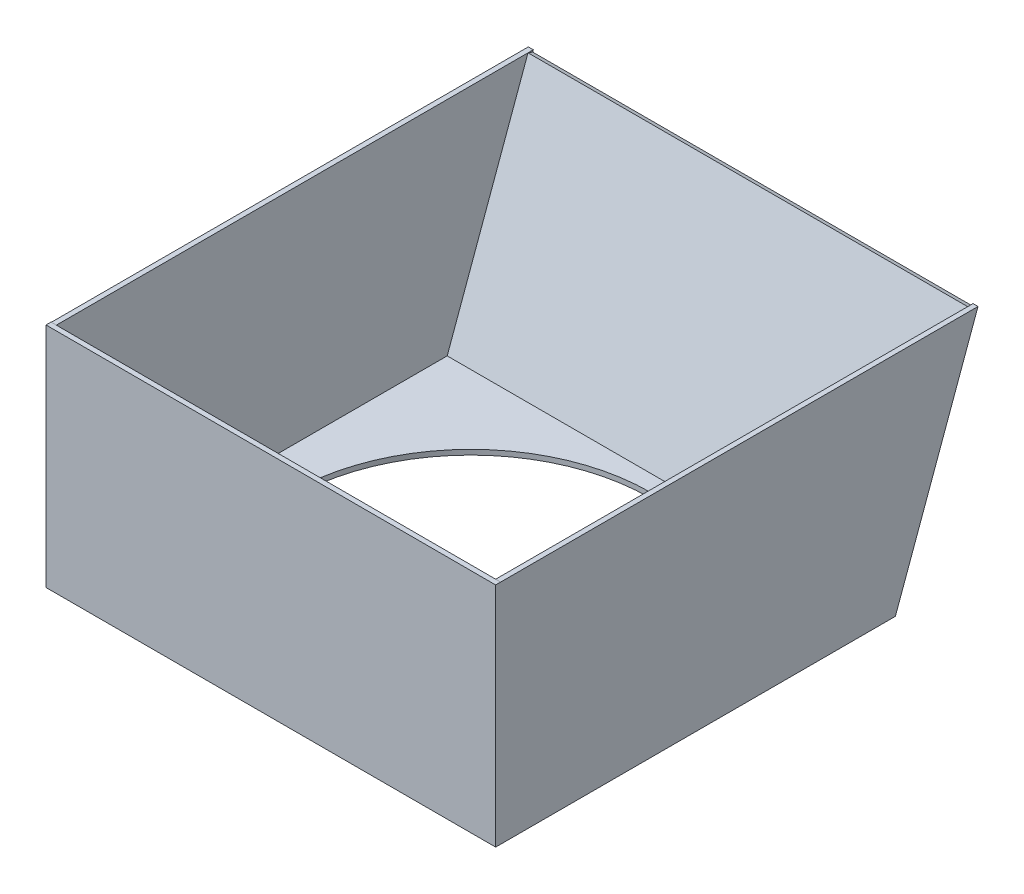
ISO-10303-21;
HEADER;
FILE_DESCRIPTION(('STEP AP214'),'2;1');
FILE_NAME('part.step','',(''),(''),'','','');
FILE_SCHEMA(('AUTOMOTIVE_DESIGN { 1 0 10303 214 1 1 1 1 }'));
ENDSEC;
DATA;
#1=APPLICATION_CONTEXT('core data for automotive mechanical design processes');
#2=APPLICATION_PROTOCOL_DEFINITION('international standard','automotive_design',2000,#1);
#3=PRODUCT_CONTEXT('',#1,'mechanical');
#4=PRODUCT('Part','Part','',(#3));
#5=PRODUCT_RELATED_PRODUCT_CATEGORY('part','',(#4));
#6=PRODUCT_DEFINITION_FORMATION('','',#4);
#7=PRODUCT_DEFINITION_CONTEXT('part definition',#1,'design');
#8=PRODUCT_DEFINITION('design','',#6,#7);
#9=PRODUCT_DEFINITION_SHAPE('','',#8);
#10=(LENGTH_UNIT() NAMED_UNIT(*) SI_UNIT(.MILLI.,.METRE.));
#11=(NAMED_UNIT(*) PLANE_ANGLE_UNIT() SI_UNIT($,.RADIAN.));
#12=(NAMED_UNIT(*) SI_UNIT($,.STERADIAN.) SOLID_ANGLE_UNIT());
#13=UNCERTAINTY_MEASURE_WITH_UNIT(LENGTH_MEASURE(1.E-05),#10,'distance_accuracy_value','');
#14=(GEOMETRIC_REPRESENTATION_CONTEXT(3) GLOBAL_UNCERTAINTY_ASSIGNED_CONTEXT((#13)) GLOBAL_UNIT_ASSIGNED_CONTEXT((#10,
#11,#12)) REPRESENTATION_CONTEXT('',''));
#15=CARTESIAN_POINT('',(0.,0.,0.));
#16=DIRECTION('',(0.,0.,1.));
#17=DIRECTION('',(1.,0.,0.));
#18=AXIS2_PLACEMENT_3D('',#15,#16,#17);
#19=CARTESIAN_POINT('',(0.,2.5,0.));
#20=DIRECTION('',(0.,1.,0.));
#21=DIRECTION('',(0.,0.,1.));
#22=AXIS2_PLACEMENT_3D('',#19,#20,#21);
#23=PLANE('',#22);
#24=DIRECTION('',(-1.,0.,0.));
#25=VECTOR('',#24,1.);
#26=CARTESIAN_POINT('',(0.,2.5,97.5));
#27=LINE('',#26,#25);
#28=CARTESIAN_POINT('',(110.,2.5,97.5));
#29=VERTEX_POINT('',#28);
#30=CARTESIAN_POINT('',(-110.,2.5,97.5));
#31=VERTEX_POINT('',#30);
#32=EDGE_CURVE('E165',#29,#31,#27,.T.);
#33=ORIENTED_EDGE('',*,*,#32,.F.);
#34=DIRECTION('',(0.,0.,1.));
#35=VECTOR('',#34,1.);
#36=CARTESIAN_POINT('',(110.,2.5,0.));
#37=LINE('',#36,#35);
#38=CARTESIAN_POINT('',(110.,2.5,-98.2494811544758));
#39=VERTEX_POINT('',#38);
#40=EDGE_CURVE('E67',#39,#29,#37,.T.);
#41=ORIENTED_EDGE('',*,*,#40,.F.);
#42=DIRECTION('',(-1.,0.,0.));
#43=VECTOR('',#42,1.);
#44=CARTESIAN_POINT('',(0.,2.5,-98.2494811544758));
#45=LINE('',#44,#43);
#46=CARTESIAN_POINT('',(-110.,2.5,-98.2494811544758));
#47=VERTEX_POINT('',#46);
#48=EDGE_CURVE('E222',#39,#47,#45,.T.);
#49=ORIENTED_EDGE('',*,*,#48,.T.);
#50=DIRECTION('',(0.,0.,1.));
#51=VECTOR('',#50,1.);
#52=CARTESIAN_POINT('',(-110.,2.5,0.));
#53=LINE('',#52,#51);
#54=EDGE_CURVE('E215',#47,#31,#53,.T.);
#55=ORIENTED_EDGE('',*,*,#54,.T.);
#56=EDGE_LOOP('',(#33,#41,#49,#55));
#57=FACE_BOUND('',#56,.T.);
#58=CARTESIAN_POINT('',(0.,2.5,0.));
#59=DIRECTION('',(0.,1.,0.));
#60=DIRECTION('',(0.,0.,1.));
#61=AXIS2_PLACEMENT_3D('',#58,#59,#60);
#62=CIRCLE('',#61,90.);
#63=CARTESIAN_POINT('',(0.,2.5,90.));
#64=VERTEX_POINT('',#63);
#65=EDGE_CURVE('E235',#64,#64,#62,.T.);
#66=ORIENTED_EDGE('',*,*,#65,.F.);
#67=EDGE_LOOP('',(#66));
#68=FACE_BOUND('',#67,.T.);
#69=ADVANCED_FACE('F43',(#57,#68),#23,.T.);
#70=CARTESIAN_POINT('',(-112.5,113.618164852623,-138.693185647115));
#71=DIRECTION('',(0.,-0.939692620785909,0.342020143325666));
#72=DIRECTION('',(0.,-0.342020143325666,-0.93969262078591));
#73=AXIS2_PLACEMENT_3D('',#70,#71,#72);
#74=PLANE('',#73);
#75=DIRECTION('',(-1.,0.,0.));
#76=VECTOR('',#75,1.);
#77=CARTESIAN_POINT('',(-112.5,113.618164852623,-138.693185647115));
#78=LINE('',#77,#76);
#79=CARTESIAN_POINT('',(110.,113.618164852623,-138.693185647115));
#80=VERTEX_POINT('',#79);
#81=CARTESIAN_POINT('',(-110.,113.618164852623,-138.693185647115));
#82=VERTEX_POINT('',#81);
#83=EDGE_CURVE('E219',#80,#82,#78,.T.);
#84=ORIENTED_EDGE('',*,*,#83,.F.);
#85=DIRECTION('',(0.,-0.342020143325666,-0.93969262078591));
#86=VECTOR('',#85,1.);
#87=CARTESIAN_POINT('',(110.,113.618164852623,-138.693185647115));
#88=LINE('',#87,#86);
#89=CARTESIAN_POINT('',(110.,112.763114494309,-141.04241719908));
#90=VERTEX_POINT('',#89);
#91=EDGE_CURVE('E187',#80,#90,#88,.T.);
#92=ORIENTED_EDGE('',*,*,#91,.T.);
#93=DIRECTION('',(-1.,0.,0.));
#94=VECTOR('',#93,1.);
#95=CARTESIAN_POINT('',(-112.5,112.763114494309,-141.04241719908));
#96=LINE('',#95,#94);
#97=CARTESIAN_POINT('',(-110.,112.763114494309,-141.04241719908));
#98=VERTEX_POINT('',#97);
#99=EDGE_CURVE('E226',#90,#98,#96,.T.);
#100=ORIENTED_EDGE('',*,*,#99,.T.);
#101=DIRECTION('',(0.,-0.342020143325666,-0.93969262078591));
#102=VECTOR('',#101,1.);
#103=CARTESIAN_POINT('',(-110.,113.618164852623,-138.693185647115));
#104=LINE('',#103,#102);
#105=EDGE_CURVE('E211',#82,#98,#104,.T.);
#106=ORIENTED_EDGE('',*,*,#105,.F.);
#107=EDGE_LOOP('',(#84,#92,#100,#106));
#108=FACE_BOUND('',#107,.T.);
#109=ADVANCED_FACE('F292',(#108),#74,.F.);
#110=CARTESIAN_POINT('',(0.,-31.2843301260126,-85.9529906039844));
#111=DIRECTION('',(0.,-0.342020143325666,-0.93969262078591));
#112=DIRECTION('',(0.,0.93969262078591,-0.342020143325666));
#113=AXIS2_PLACEMENT_3D('',#110,#111,#112);
#114=PLANE('',#113);
#115=ORIENTED_EDGE('',*,*,#48,.F.);
#116=DIRECTION('',(0.,0.93969262078591,-0.342020143325666));
#117=VECTOR('',#116,1.);
#118=CARTESIAN_POINT('',(110.,-31.2843301260126,-85.9529906039844));
#119=LINE('',#118,#117);
#120=EDGE_CURVE('E59',#39,#80,#119,.T.);
#121=ORIENTED_EDGE('',*,*,#120,.T.);
#122=ORIENTED_EDGE('',*,*,#83,.T.);
#123=DIRECTION('',(0.,0.93969262078591,-0.342020143325666));
#124=VECTOR('',#123,1.);
#125=CARTESIAN_POINT('',(-110.,-31.2843301260126,-85.9529906039844));
#126=LINE('',#125,#124);
#127=EDGE_CURVE('E207',#47,#82,#126,.T.);
#128=ORIENTED_EDGE('',*,*,#127,.F.);
#129=EDGE_LOOP('',(#115,#121,#122,#128));
#130=FACE_BOUND('',#129,.T.);
#131=ADVANCED_FACE('F298',(#130),#114,.F.);
#132=CARTESIAN_POINT('',(0.,0.,0.));
#133=DIRECTION('',(0.,1.,0.));
#134=DIRECTION('',(0.,0.,1.));
#135=AXIS2_PLACEMENT_3D('',#132,#133,#134);
#136=PLANE('',#135);
#137=DIRECTION('',(-1.,0.,0.));
#138=VECTOR('',#137,1.);
#139=CARTESIAN_POINT('',(-112.5,0.,-100.));
#140=LINE('',#139,#138);
#141=CARTESIAN_POINT('',(112.5,0.,-100.));
#142=VERTEX_POINT('',#141);
#143=CARTESIAN_POINT('',(-112.5,0.,-100.));
#144=VERTEX_POINT('',#143);
#145=EDGE_CURVE('E245',#142,#144,#140,.T.);
#146=ORIENTED_EDGE('',*,*,#145,.F.);
#147=DIRECTION('',(0.,0.,-1.));
#148=VECTOR('',#147,1.);
#149=CARTESIAN_POINT('',(112.5,0.,-100.));
#150=LINE('',#149,#148);
#151=CARTESIAN_POINT('',(112.5,0.,100.));
#152=VERTEX_POINT('',#151);
#153=EDGE_CURVE('E239',#152,#142,#150,.T.);
#154=ORIENTED_EDGE('',*,*,#153,.F.);
#155=DIRECTION('',(1.,0.,0.));
#156=VECTOR('',#155,1.);
#157=CARTESIAN_POINT('',(-112.5,0.,100.));
#158=LINE('',#157,#156);
#159=CARTESIAN_POINT('',(-112.5,0.,100.));
#160=VERTEX_POINT('',#159);
#161=EDGE_CURVE('E251',#160,#152,#158,.T.);
#162=ORIENTED_EDGE('',*,*,#161,.F.);
#163=DIRECTION('',(0.,0.,1.));
#164=VECTOR('',#163,1.);
#165=CARTESIAN_POINT('',(-112.5,0.,-100.));
#166=LINE('',#165,#164);
#167=EDGE_CURVE('E248',#144,#160,#166,.T.);
#168=ORIENTED_EDGE('',*,*,#167,.F.);
#169=EDGE_LOOP('',(#146,#154,#162,#168));
#170=FACE_BOUND('',#169,.T.);
#171=CARTESIAN_POINT('',(0.,0.,0.));
#172=DIRECTION('',(0.,1.,0.));
#173=DIRECTION('',(0.,0.,1.));
#174=AXIS2_PLACEMENT_3D('',#171,#172,#173);
#175=CIRCLE('',#174,90.);
#176=CARTESIAN_POINT('',(0.,0.,90.));
#177=VERTEX_POINT('',#176);
#178=EDGE_CURVE('E234',#177,#177,#175,.T.);
#179=ORIENTED_EDGE('',*,*,#178,.T.);
#180=EDGE_LOOP('',(#179));
#181=FACE_BOUND('',#180,.T.);
#182=ADVANCED_FACE('F266',(#170,#181),#136,.F.);
#183=CARTESIAN_POINT('',(112.5,2.5,-100.));
#184=DIRECTION('',(-1.,0.,0.));
#185=DIRECTION('',(0.,0.,1.));
#186=AXIS2_PLACEMENT_3D('',#183,#184,#185);
#187=PLANE('',#186);
#188=DIRECTION('',(0.,0.,1.));
#189=VECTOR('',#188,1.);
#190=CARTESIAN_POINT('',(112.5,113.618164852623,-141.353630078305));
#191=LINE('',#190,#189);
#192=CARTESIAN_POINT('',(112.5,113.618164852623,-141.353630078305));
#193=VERTEX_POINT('',#192);
#194=CARTESIAN_POINT('',(112.5,113.618164852623,97.5));
#195=VERTEX_POINT('',#194);
#196=EDGE_CURVE('E160',#193,#195,#191,.T.);
#197=ORIENTED_EDGE('',*,*,#196,.T.);
#198=DIRECTION('',(0.,0.,1.));
#199=VECTOR('',#198,1.);
#200=CARTESIAN_POINT('',(112.5,113.618164852623,97.5));
#201=LINE('',#200,#199);
#202=CARTESIAN_POINT('',(112.5,113.618164852623,100.));
#203=VERTEX_POINT('',#202);
#204=EDGE_CURVE('E131',#195,#203,#201,.T.);
#205=ORIENTED_EDGE('',*,*,#204,.T.);
#206=DIRECTION('',(0.,-1.,0.));
#207=VECTOR('',#206,1.);
#208=CARTESIAN_POINT('',(112.5,2.5,100.));
#209=LINE('',#208,#207);
#210=EDGE_CURVE('E254',#203,#152,#209,.T.);
#211=ORIENTED_EDGE('',*,*,#210,.T.);
#212=ORIENTED_EDGE('',*,*,#153,.T.);
#213=DIRECTION('',(0.,0.93969262078591,-0.342020143325666));
#214=VECTOR('',#213,1.);
#215=CARTESIAN_POINT('',(112.5,112.763114494309,-141.04241719908));
#216=LINE('',#215,#214);
#217=EDGE_CURVE('E168',#142,#193,#216,.T.);
#218=ORIENTED_EDGE('',*,*,#217,.T.);
#219=EDGE_LOOP('',(#197,#205,#211,#212,#218));
#220=FACE_BOUND('',#219,.T.);
#221=ADVANCED_FACE('F45',(#220),#187,.F.);
#222=CARTESIAN_POINT('',(-112.5,2.5,-100.));
#223=DIRECTION('',(1.,0.,0.));
#224=DIRECTION('',(0.,0.,-1.));
#225=AXIS2_PLACEMENT_3D('',#222,#223,#224);
#226=PLANE('',#225);
#227=ORIENTED_EDGE('',*,*,#167,.T.);
#228=DIRECTION('',(0.,-1.,0.));
#229=VECTOR('',#228,1.);
#230=CARTESIAN_POINT('',(-112.5,2.5,100.));
#231=LINE('',#230,#229);
#232=CARTESIAN_POINT('',(-112.5,113.791515022828,100.));
#233=VERTEX_POINT('',#232);
#234=EDGE_CURVE('E52',#233,#160,#231,.T.);
#235=ORIENTED_EDGE('',*,*,#234,.F.);
#236=DIRECTION('',(0.,0.,1.));
#237=VECTOR('',#236,1.);
#238=CARTESIAN_POINT('',(-112.5,113.791515022828,97.5));
#239=LINE('',#238,#237);
#240=CARTESIAN_POINT('',(-112.5,113.791515022828,97.5));
#241=VERTEX_POINT('',#240);
#242=EDGE_CURVE('E144',#241,#233,#239,.T.);
#243=ORIENTED_EDGE('',*,*,#242,.F.);
#244=DIRECTION('',(0.,-1.,0.));
#245=VECTOR('',#244,1.);
#246=CARTESIAN_POINT('',(-112.5,0.,97.5));
#247=LINE('',#246,#245);
#248=CARTESIAN_POINT('',(-112.5,113.618164852623,97.5));
#249=VERTEX_POINT('',#248);
#250=EDGE_CURVE('E145',#241,#249,#247,.T.);
#251=ORIENTED_EDGE('',*,*,#250,.T.);
#252=DIRECTION('',(0.,0.,-1.));
#253=VECTOR('',#252,1.);
#254=CARTESIAN_POINT('',(-112.5,113.618164852623,-141.353630078305));
#255=LINE('',#254,#253);
#256=CARTESIAN_POINT('',(-112.5,113.618164852623,-141.353630078305));
#257=VERTEX_POINT('',#256);
#258=EDGE_CURVE('E192',#249,#257,#255,.T.);
#259=ORIENTED_EDGE('',*,*,#258,.T.);
#260=DIRECTION('',(0.,-0.93969262078591,0.342020143325666));
#261=VECTOR('',#260,1.);
#262=CARTESIAN_POINT('',(-112.5,0.,-100.));
#263=LINE('',#262,#261);
#264=EDGE_CURVE('E223',#257,#144,#263,.T.);
#265=ORIENTED_EDGE('',*,*,#264,.T.);
#266=EDGE_LOOP('',(#227,#235,#243,#251,#259,#265));
#267=FACE_BOUND('',#266,.T.);
#268=ADVANCED_FACE('F312',(#267),#226,.F.);
#269=CARTESIAN_POINT('',(-112.5,2.5,100.));
#270=DIRECTION('',(0.,0.,-1.));
#271=DIRECTION('',(-1.,0.,0.));
#272=AXIS2_PLACEMENT_3D('',#269,#270,#271);
#273=PLANE('',#272);
#274=DIRECTION('',(-0.999999703207228,0.000770444972247089,0.));
#275=VECTOR('',#274,1.);
#276=CARTESIAN_POINT('',(-112.5,113.791515022828,100.));
#277=LINE('',#276,#275);
#278=EDGE_CURVE('E138',#203,#233,#277,.T.);
#279=ORIENTED_EDGE('',*,*,#278,.T.);
#280=ORIENTED_EDGE('',*,*,#234,.T.);
#281=ORIENTED_EDGE('',*,*,#161,.T.);
#282=ORIENTED_EDGE('',*,*,#210,.F.);
#283=EDGE_LOOP('',(#279,#280,#281,#282));
#284=FACE_BOUND('',#283,.T.);
#285=ADVANCED_FACE('F260',(#284),#273,.F.);
#286=CARTESIAN_POINT('',(0.,2.5,0.));
#287=DIRECTION('',(0.,-1.,0.));
#288=DIRECTION('',(0.,0.,-1.));
#289=AXIS2_PLACEMENT_3D('',#286,#287,#288);
#290=CYLINDRICAL_SURFACE('',#289,90.);
#291=ORIENTED_EDGE('',*,*,#65,.T.);
#292=EDGE_LOOP('',(#291));
#293=FACE_BOUND('',#292,.T.);
#294=ORIENTED_EDGE('',*,*,#178,.F.);
#295=EDGE_LOOP('',(#294));
#296=FACE_BOUND('',#295,.T.);
#297=ADVANCED_FACE('F318',(#293,#296),#290,.F.);
#298=CARTESIAN_POINT('',(0.,-32.1393804843268,-88.3022221559492));
#299=DIRECTION('',(0.,-0.342020143325666,-0.93969262078591));
#300=DIRECTION('',(0.,0.93969262078591,-0.342020143325666));
#301=AXIS2_PLACEMENT_3D('',#298,#299,#300);
#302=PLANE('',#301);
#303=ORIENTED_EDGE('',*,*,#99,.F.);
#304=DIRECTION('',(0.,0.939692620785909,-0.342020143325666));
#305=VECTOR('',#304,1.);
#306=CARTESIAN_POINT('',(110.,0.,-100.));
#307=LINE('',#306,#305);
#308=CARTESIAN_POINT('',(110.,113.618164852623,-141.353630078305));
#309=VERTEX_POINT('',#308);
#310=EDGE_CURVE('E171',#90,#309,#307,.T.);
#311=ORIENTED_EDGE('',*,*,#310,.T.);
#312=DIRECTION('',(1.,0.,0.));
#313=VECTOR('',#312,1.);
#314=CARTESIAN_POINT('',(110.,113.618164852623,-141.353630078305));
#315=LINE('',#314,#313);
#316=EDGE_CURVE('E182',#309,#193,#315,.T.);
#317=ORIENTED_EDGE('',*,*,#316,.T.);
#318=ORIENTED_EDGE('',*,*,#217,.F.);
#319=ORIENTED_EDGE('',*,*,#145,.T.);
#320=ORIENTED_EDGE('',*,*,#264,.F.);
#321=DIRECTION('',(-1.,0.,0.));
#322=VECTOR('',#321,1.);
#323=CARTESIAN_POINT('',(-110.,113.618164852623,-141.353630078305));
#324=LINE('',#323,#322);
#325=CARTESIAN_POINT('',(-110.,113.618164852623,-141.353630078305));
#326=VERTEX_POINT('',#325);
#327=EDGE_CURVE('E201',#326,#257,#324,.T.);
#328=ORIENTED_EDGE('',*,*,#327,.F.);
#329=DIRECTION('',(0.,-0.93969262078591,0.342020143325666));
#330=VECTOR('',#329,1.);
#331=CARTESIAN_POINT('',(-110.,0.,-100.));
#332=LINE('',#331,#330);
#333=EDGE_CURVE('E196',#326,#98,#332,.T.);
#334=ORIENTED_EDGE('',*,*,#333,.T.);
#335=EDGE_LOOP('',(#303,#311,#317,#318,#319,#320,#328,#334));
#336=FACE_BOUND('',#335,.T.);
#337=ADVANCED_FACE('F271',(#336),#302,.T.);
#338=CARTESIAN_POINT('',(-110.,113.618164852623,-141.353630078305));
#339=DIRECTION('',(0.,1.,0.));
#340=DIRECTION('',(0.,0.,1.));
#341=AXIS2_PLACEMENT_3D('',#338,#339,#340);
#342=PLANE('',#341);
#343=DIRECTION('',(-1.,0.,0.));
#344=VECTOR('',#343,1.);
#345=CARTESIAN_POINT('',(-110.,113.618164852623,97.5));
#346=LINE('',#345,#344);
#347=CARTESIAN_POINT('',(-110.,113.618164852623,97.5));
#348=VERTEX_POINT('',#347);
#349=EDGE_CURVE('E172',#348,#249,#346,.T.);
#350=ORIENTED_EDGE('',*,*,#349,.F.);
#351=DIRECTION('',(0.,0.,-1.));
#352=VECTOR('',#351,1.);
#353=CARTESIAN_POINT('',(-110.,113.618164852623,-141.353630078305));
#354=LINE('',#353,#352);
#355=EDGE_CURVE('E193',#348,#82,#354,.T.);
#356=ORIENTED_EDGE('',*,*,#355,.T.);
#357=EDGE_CURVE('E197',#82,#326,#354,.T.);
#358=ORIENTED_EDGE('',*,*,#357,.T.);
#359=ORIENTED_EDGE('',*,*,#327,.T.);
#360=ORIENTED_EDGE('',*,*,#258,.F.);
#361=EDGE_LOOP('',(#350,#356,#358,#359,#360));
#362=FACE_BOUND('',#361,.T.);
#363=ADVANCED_FACE('F284',(#362),#342,.T.);
#364=CARTESIAN_POINT('',(-110.,0.,0.));
#365=DIRECTION('',(-1.,0.,0.));
#366=DIRECTION('',(0.,0.,1.));
#367=AXIS2_PLACEMENT_3D('',#364,#365,#366);
#368=PLANE('',#367);
#369=ORIENTED_EDGE('',*,*,#357,.F.);
#370=ORIENTED_EDGE('',*,*,#105,.T.);
#371=ORIENTED_EDGE('',*,*,#333,.F.);
#372=EDGE_LOOP('',(#369,#370,#371));
#373=FACE_BOUND('',#372,.T.);
#374=ADVANCED_FACE('F289',(#373),#368,.F.);
#375=ORIENTED_EDGE('',*,*,#355,.F.);
#376=DIRECTION('',(0.,-1.,0.));
#377=VECTOR('',#376,1.);
#378=CARTESIAN_POINT('',(-110.,0.,97.5));
#379=LINE('',#378,#377);
#380=EDGE_CURVE('E177',#348,#31,#379,.T.);
#381=ORIENTED_EDGE('',*,*,#380,.T.);
#382=ORIENTED_EDGE('',*,*,#54,.F.);
#383=ORIENTED_EDGE('',*,*,#127,.T.);
#384=EDGE_LOOP('',(#375,#381,#382,#383));
#385=FACE_BOUND('',#384,.T.);
#386=ADVANCED_FACE('F296',(#385),#368,.F.);
#387=CARTESIAN_POINT('',(110.,113.618164852623,-141.353630078305));
#388=DIRECTION('',(0.,1.,0.));
#389=DIRECTION('',(0.,0.,1.));
#390=AXIS2_PLACEMENT_3D('',#387,#388,#389);
#391=PLANE('',#390);
#392=DIRECTION('',(-1.,0.,0.));
#393=VECTOR('',#392,1.);
#394=CARTESIAN_POINT('',(110.,113.618164852623,97.5));
#395=LINE('',#394,#393);
#396=CARTESIAN_POINT('',(110.,113.618164852623,97.5));
#397=VERTEX_POINT('',#396);
#398=EDGE_CURVE('E150',#195,#397,#395,.T.);
#399=ORIENTED_EDGE('',*,*,#398,.F.);
#400=ORIENTED_EDGE('',*,*,#196,.F.);
#401=ORIENTED_EDGE('',*,*,#316,.F.);
#402=DIRECTION('',(0.,0.,1.));
#403=VECTOR('',#402,1.);
#404=CARTESIAN_POINT('',(110.,113.618164852623,-141.353630078305));
#405=LINE('',#404,#403);
#406=EDGE_CURVE('E181',#309,#80,#405,.T.);
#407=ORIENTED_EDGE('',*,*,#406,.T.);
#408=EDGE_CURVE('E163',#80,#397,#405,.T.);
#409=ORIENTED_EDGE('',*,*,#408,.T.);
#410=EDGE_LOOP('',(#399,#400,#401,#407,#409));
#411=FACE_BOUND('',#410,.T.);
#412=ADVANCED_FACE('F158',(#411),#391,.T.);
#413=CARTESIAN_POINT('',(110.,0.,0.));
#414=DIRECTION('',(-1.,0.,0.));
#415=DIRECTION('',(0.,0.,1.));
#416=AXIS2_PLACEMENT_3D('',#413,#414,#415);
#417=PLANE('',#416);
#418=ORIENTED_EDGE('',*,*,#91,.F.);
#419=ORIENTED_EDGE('',*,*,#406,.F.);
#420=ORIENTED_EDGE('',*,*,#310,.F.);
#421=EDGE_LOOP('',(#418,#419,#420));
#422=FACE_BOUND('',#421,.T.);
#423=ADVANCED_FACE('F276',(#422),#417,.T.);
#424=DIRECTION('',(0.,-1.,0.));
#425=VECTOR('',#424,1.);
#426=CARTESIAN_POINT('',(110.,0.,97.5));
#427=LINE('',#426,#425);
#428=EDGE_CURVE('E11',#397,#29,#427,.T.);
#429=ORIENTED_EDGE('',*,*,#428,.F.);
#430=ORIENTED_EDGE('',*,*,#408,.F.);
#431=ORIENTED_EDGE('',*,*,#120,.F.);
#432=ORIENTED_EDGE('',*,*,#40,.T.);
#433=EDGE_LOOP('',(#429,#430,#431,#432));
#434=FACE_BOUND('',#433,.T.);
#435=ADVANCED_FACE('F300',(#434),#417,.T.);
#436=CARTESIAN_POINT('',(-112.5,113.791515022828,97.5));
#437=DIRECTION('',(0.000770444972247089,0.999999703207228,0.));
#438=DIRECTION('',(-0.999999703207228,0.000770444972247089,0.));
#439=AXIS2_PLACEMENT_3D('',#436,#437,#438);
#440=PLANE('',#439);
#441=ORIENTED_EDGE('',*,*,#278,.F.);
#442=ORIENTED_EDGE('',*,*,#204,.F.);
#443=DIRECTION('',(-0.999999703207228,0.000770444972247089,0.));
#444=VECTOR('',#443,1.);
#445=CARTESIAN_POINT('',(-112.5,113.791515022828,97.5));
#446=LINE('',#445,#444);
#447=EDGE_CURVE('E135',#195,#241,#446,.T.);
#448=ORIENTED_EDGE('',*,*,#447,.T.);
#449=ORIENTED_EDGE('',*,*,#242,.T.);
#450=EDGE_LOOP('',(#441,#442,#448,#449));
#451=FACE_BOUND('',#450,.T.);
#452=ADVANCED_FACE('F133',(#451),#440,.T.);
#453=CARTESIAN_POINT('',(0.,0.,97.5));
#454=DIRECTION('',(0.,0.,-1.));
#455=DIRECTION('',(-1.,0.,0.));
#456=AXIS2_PLACEMENT_3D('',#453,#454,#455);
#457=PLANE('',#456);
#458=ORIENTED_EDGE('',*,*,#380,.F.);
#459=ORIENTED_EDGE('',*,*,#349,.T.);
#460=ORIENTED_EDGE('',*,*,#250,.F.);
#461=ORIENTED_EDGE('',*,*,#447,.F.);
#462=ORIENTED_EDGE('',*,*,#398,.T.);
#463=ORIENTED_EDGE('',*,*,#428,.T.);
#464=ORIENTED_EDGE('',*,*,#32,.T.);
#465=EDGE_LOOP('',(#458,#459,#460,#461,#462,#463,#464));
#466=FACE_BOUND('',#465,.T.);
#467=ADVANCED_FACE('F149',(#466),#457,.T.);
#468=CLOSED_SHELL('',(#69,#109,#131,#182,#221,#268,#285,#297,#337,#363,#374,#386,#412,#423,#435,
#452,#467));
#469=MANIFOLD_SOLID_BREP('B2',#468);
#470=ADVANCED_BREP_SHAPE_REPRESENTATION('',(#18,#469),#14);
#471=SHAPE_DEFINITION_REPRESENTATION(#9,#470);
ENDSEC;
END-ISO-10303-21;
